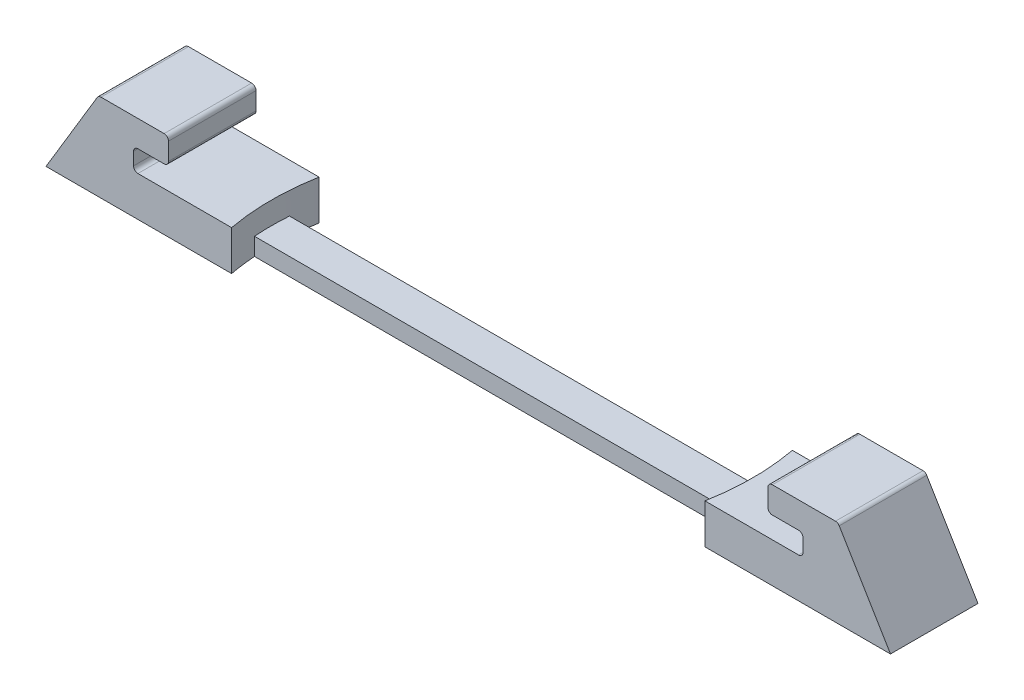
ISO-10303-21;
HEADER;
FILE_DESCRIPTION(('STEP AP214'),'2;1');
FILE_NAME('part.step','',(''),(''),'','','');
FILE_SCHEMA(('AUTOMOTIVE_DESIGN { 1 0 10303 214 1 1 1 1 }'));
ENDSEC;
DATA;
#1=APPLICATION_CONTEXT('core data for automotive mechanical design processes');
#2=APPLICATION_PROTOCOL_DEFINITION('international standard','automotive_design',2000,#1);
#3=PRODUCT_CONTEXT('',#1,'mechanical');
#4=PRODUCT('Part','Part','',(#3));
#5=PRODUCT_RELATED_PRODUCT_CATEGORY('part','',(#4));
#6=PRODUCT_DEFINITION_FORMATION('','',#4);
#7=PRODUCT_DEFINITION_CONTEXT('part definition',#1,'design');
#8=PRODUCT_DEFINITION('design','',#6,#7);
#9=PRODUCT_DEFINITION_SHAPE('','',#8);
#10=(LENGTH_UNIT() NAMED_UNIT(*) SI_UNIT(.MILLI.,.METRE.));
#11=(NAMED_UNIT(*) PLANE_ANGLE_UNIT() SI_UNIT($,.RADIAN.));
#12=(NAMED_UNIT(*) SI_UNIT($,.STERADIAN.) SOLID_ANGLE_UNIT());
#13=UNCERTAINTY_MEASURE_WITH_UNIT(LENGTH_MEASURE(1.E-05),#10,'distance_accuracy_value','');
#14=(GEOMETRIC_REPRESENTATION_CONTEXT(3) GLOBAL_UNCERTAINTY_ASSIGNED_CONTEXT((#13)) GLOBAL_UNIT_ASSIGNED_CONTEXT((#10,
#11,#12)) REPRESENTATION_CONTEXT('',''));
#15=CARTESIAN_POINT('',(0.,0.,0.));
#16=DIRECTION('',(0.,0.,1.));
#17=DIRECTION('',(1.,0.,0.));
#18=AXIS2_PLACEMENT_3D('',#15,#16,#17);
#19=CARTESIAN_POINT('',(0.,-2.55,0.));
#20=DIRECTION('',(0.,1.,0.));
#21=DIRECTION('',(0.,0.,1.));
#22=AXIS2_PLACEMENT_3D('',#19,#20,#21);
#23=PLANE('',#22);
#24=DIRECTION('',(-1.,0.,0.));
#25=VECTOR('',#24,1.);
#26=CARTESIAN_POINT('',(-65.6,-2.55,87.9999115054572));
#27=LINE('',#26,#25);
#28=CARTESIAN_POINT('',(-10.6728301493939,-2.55,87.9999115054572));
#29=VERTEX_POINT('',#28);
#30=CARTESIAN_POINT('',(-65.5271698506061,-2.55,87.9999115054572));
#31=VERTEX_POINT('',#30);
#32=EDGE_CURVE('E314',#29,#31,#27,.T.);
#33=ORIENTED_EDGE('',*,*,#32,.T.);
#34=CARTESIAN_POINT('',(-38.1,-2.55,90.));
#35=DIRECTION('',(0.,1.,0.));
#36=DIRECTION('',(0.,0.,1.));
#37=AXIS2_PLACEMENT_3D('',#34,#35,#36);
#38=CIRCLE('',#37,27.5);
#39=CARTESIAN_POINT('',(-65.5271827567168,-2.55,91.9999115054572));
#40=VERTEX_POINT('',#39);
#41=EDGE_CURVE('E306',#31,#40,#38,.T.);
#42=ORIENTED_EDGE('',*,*,#41,.T.);
#43=DIRECTION('',(1.,0.,0.));
#44=VECTOR('',#43,1.);
#45=CARTESIAN_POINT('',(-10.6,-2.55,91.9999115054572));
#46=LINE('',#45,#44);
#47=CARTESIAN_POINT('',(-10.6728172432833,-2.55,91.9999115054572));
#48=VERTEX_POINT('',#47);
#49=EDGE_CURVE('E317',#40,#48,#46,.T.);
#50=ORIENTED_EDGE('',*,*,#49,.T.);
#51=CARTESIAN_POINT('',(-38.1,-2.55,90.));
#52=DIRECTION('',(0.,1.,0.));
#53=DIRECTION('',(0.,0.,1.));
#54=AXIS2_PLACEMENT_3D('',#51,#52,#53);
#55=CIRCLE('',#54,27.5);
#56=EDGE_CURVE('E11',#29,#48,#55,.F.);
#57=ORIENTED_EDGE('',*,*,#56,.F.);
#58=EDGE_LOOP('',(#33,#42,#50,#57));
#59=FACE_BOUND('',#58,.T.);
#60=ADVANCED_FACE('F45',(#59),#23,.T.);
#61=CARTESIAN_POINT('',(-65.6,-2.55,87.9999115054572));
#62=DIRECTION('',(0.,0.,1.));
#63=DIRECTION('',(1.,0.,0.));
#64=AXIS2_PLACEMENT_3D('',#61,#62,#63);
#65=PLANE('',#64);
#66=DIRECTION('',(0.,1.,0.));
#67=VECTOR('',#66,1.);
#68=CARTESIAN_POINT('',(-65.5271698506061,-4.55000000000001,87.9999115054572));
#69=LINE('',#68,#67);
#70=CARTESIAN_POINT('',(-65.5271698506061,-4.55,87.9999115054572));
#71=VERTEX_POINT('',#70);
#72=EDGE_CURVE('E65',#31,#71,#69,.F.);
#73=ORIENTED_EDGE('',*,*,#72,.F.);
#74=ORIENTED_EDGE('',*,*,#32,.F.);
#75=DIRECTION('',(0.,1.,0.));
#76=VECTOR('',#75,1.);
#77=CARTESIAN_POINT('',(-10.6728301493939,-4.55000000000001,87.9999115054572));
#78=LINE('',#77,#76);
#79=CARTESIAN_POINT('',(-10.6728301493939,-4.55,87.9999115054572));
#80=VERTEX_POINT('',#79);
#81=EDGE_CURVE('E329',#29,#80,#78,.F.);
#82=ORIENTED_EDGE('',*,*,#81,.T.);
#83=DIRECTION('',(-1.,0.,0.));
#84=VECTOR('',#83,1.);
#85=CARTESIAN_POINT('',(-65.6,-4.55,87.9999115054572));
#86=LINE('',#85,#84);
#87=EDGE_CURVE('E61',#80,#71,#86,.T.);
#88=ORIENTED_EDGE('',*,*,#87,.T.);
#89=EDGE_LOOP('',(#73,#74,#82,#88));
#90=FACE_BOUND('',#89,.T.);
#91=ADVANCED_FACE('F680',(#90),#65,.F.);
#92=CARTESIAN_POINT('',(-10.6,-2.55,91.9999115054572));
#93=DIRECTION('',(0.,0.,-1.));
#94=DIRECTION('',(-1.,0.,0.));
#95=AXIS2_PLACEMENT_3D('',#92,#93,#94);
#96=PLANE('',#95);
#97=DIRECTION('',(0.,1.,0.));
#98=VECTOR('',#97,1.);
#99=CARTESIAN_POINT('',(-65.5271827567168,-4.55000000000001,91.9999115054572));
#100=LINE('',#99,#98);
#101=CARTESIAN_POINT('',(-65.5271827567168,-4.55,91.9999115054572));
#102=VERTEX_POINT('',#101);
#103=EDGE_CURVE('E297',#102,#40,#100,.T.);
#104=ORIENTED_EDGE('',*,*,#103,.F.);
#105=DIRECTION('',(1.,0.,0.));
#106=VECTOR('',#105,1.);
#107=CARTESIAN_POINT('',(-10.6,-4.55,91.9999115054572));
#108=LINE('',#107,#106);
#109=CARTESIAN_POINT('',(-10.6728172432833,-4.55,91.9999115054572));
#110=VERTEX_POINT('',#109);
#111=EDGE_CURVE('E318',#102,#110,#108,.T.);
#112=ORIENTED_EDGE('',*,*,#111,.T.);
#113=DIRECTION('',(0.,1.,0.));
#114=VECTOR('',#113,1.);
#115=CARTESIAN_POINT('',(-10.6728172432833,-4.55000000000001,91.9999115054572));
#116=LINE('',#115,#114);
#117=EDGE_CURVE('E321',#110,#48,#116,.T.);
#118=ORIENTED_EDGE('',*,*,#117,.T.);
#119=ORIENTED_EDGE('',*,*,#49,.F.);
#120=EDGE_LOOP('',(#104,#112,#118,#119));
#121=FACE_BOUND('',#120,.T.);
#122=ADVANCED_FACE('F687',(#121),#96,.F.);
#123=CARTESIAN_POINT('',(-38.1,-4.55000000000001,90.));
#124=DIRECTION('',(0.,1.,0.));
#125=DIRECTION('',(0.,0.,1.));
#126=AXIS2_PLACEMENT_3D('',#123,#124,#125);
#127=CYLINDRICAL_SURFACE('',#126,27.5);
#128=ORIENTED_EDGE('',*,*,#81,.F.);
#129=ORIENTED_EDGE('',*,*,#56,.T.);
#130=ORIENTED_EDGE('',*,*,#117,.F.);
#131=CARTESIAN_POINT('',(-38.1,-4.55000000000001,90.));
#132=DIRECTION('',(0.,1.,0.));
#133=DIRECTION('',(0.,0.,1.));
#134=AXIS2_PLACEMENT_3D('',#131,#132,#133);
#135=CIRCLE('',#134,27.5);
#136=CARTESIAN_POINT('',(-11.0583654340201,-4.55000000000001,95.));
#137=VERTEX_POINT('',#136);
#138=EDGE_CURVE('E418',#137,#110,#135,.T.);
#139=ORIENTED_EDGE('',*,*,#138,.F.);
#140=DIRECTION('',(0.,1.,0.));
#141=VECTOR('',#140,1.);
#142=CARTESIAN_POINT('',(-11.0583654340201,-4.55000000000001,95.));
#143=LINE('',#142,#141);
#144=CARTESIAN_POINT('',(-11.0583654340201,0.,95.));
#145=VERTEX_POINT('',#144);
#146=EDGE_CURVE('E54',#137,#145,#143,.T.);
#147=ORIENTED_EDGE('',*,*,#146,.T.);
#148=CARTESIAN_POINT('',(-38.1,0.,90.));
#149=DIRECTION('',(0.,1.,0.));
#150=DIRECTION('',(0.,0.,1.));
#151=AXIS2_PLACEMENT_3D('',#148,#149,#150);
#152=CIRCLE('',#151,27.5);
#153=CARTESIAN_POINT('',(-11.0583654340201,0.,85.));
#154=VERTEX_POINT('',#153);
#155=EDGE_CURVE('E417',#145,#154,#152,.T.);
#156=ORIENTED_EDGE('',*,*,#155,.T.);
#157=DIRECTION('',(0.,1.,0.));
#158=VECTOR('',#157,1.);
#159=CARTESIAN_POINT('',(-11.0583654340201,-4.55000000000001,85.));
#160=LINE('',#159,#158);
#161=CARTESIAN_POINT('',(-11.0583654340201,-4.55000000000001,85.));
#162=VERTEX_POINT('',#161);
#163=EDGE_CURVE('E470',#162,#154,#160,.T.);
#164=ORIENTED_EDGE('',*,*,#163,.F.);
#165=EDGE_CURVE('E423',#80,#162,#135,.T.);
#166=ORIENTED_EDGE('',*,*,#165,.F.);
#167=EDGE_LOOP('',(#128,#129,#130,#139,#147,#156,#164,#166));
#168=FACE_BOUND('',#167,.T.);
#169=ADVANCED_FACE('F478',(#168),#127,.F.);
#170=CARTESIAN_POINT('',(-0.350000000000003,0.499999999999991,180.));
#171=DIRECTION('',(0.,0.,-1.));
#172=DIRECTION('',(-1.,0.,0.));
#173=AXIS2_PLACEMENT_3D('',#170,#171,#172);
#174=CYLINDRICAL_SURFACE('',#173,0.5);
#175=DIRECTION('',(0.,0.,-1.));
#176=VECTOR('',#175,1.);
#177=CARTESIAN_POINT('',(-0.350000000000003,0.,180.));
#178=LINE('',#177,#176);
#179=CARTESIAN_POINT('',(-0.350000000000003,0.,95.));
#180=VERTEX_POINT('',#179);
#181=CARTESIAN_POINT('',(-0.350000000000003,0.,85.));
#182=VERTEX_POINT('',#181);
#183=EDGE_CURVE('E422',#180,#182,#178,.T.);
#184=ORIENTED_EDGE('',*,*,#183,.F.);
#185=CARTESIAN_POINT('',(-0.350000000000003,0.499999999999991,95.));
#186=DIRECTION('',(0.,0.,-1.));
#187=DIRECTION('',(-1.,0.,0.));
#188=AXIS2_PLACEMENT_3D('',#185,#186,#187);
#189=CIRCLE('',#188,0.5);
#190=CARTESIAN_POINT('',(0.149999999999997,0.499999999999991,95.));
#191=VERTEX_POINT('',#190);
#192=EDGE_CURVE('E387',#180,#191,#189,.F.);
#193=ORIENTED_EDGE('',*,*,#192,.T.);
#194=DIRECTION('',(0.,0.,-1.));
#195=VECTOR('',#194,1.);
#196=CARTESIAN_POINT('',(0.149999999999997,0.499999999999991,180.));
#197=LINE('',#196,#195);
#198=CARTESIAN_POINT('',(0.149999999999997,0.499999999999991,85.));
#199=VERTEX_POINT('',#198);
#200=EDGE_CURVE('E430',#191,#199,#197,.T.);
#201=ORIENTED_EDGE('',*,*,#200,.T.);
#202=CARTESIAN_POINT('',(-0.350000000000003,0.499999999999991,85.));
#203=DIRECTION('',(0.,0.,-1.));
#204=DIRECTION('',(-1.,0.,0.));
#205=AXIS2_PLACEMENT_3D('',#202,#203,#204);
#206=CIRCLE('',#205,0.5);
#207=EDGE_CURVE('E351',#182,#199,#206,.F.);
#208=ORIENTED_EDGE('',*,*,#207,.F.);
#209=EDGE_LOOP('',(#184,#193,#201,#208));
#210=FACE_BOUND('',#209,.T.);
#211=ADVANCED_FACE('F491',(#210),#174,.F.);
#212=CARTESIAN_POINT('',(0.149999999999997,0.,180.));
#213=DIRECTION('',(1.,0.,0.));
#214=DIRECTION('',(0.,0.,-1.));
#215=AXIS2_PLACEMENT_3D('',#212,#213,#214);
#216=PLANE('',#215);
#217=ORIENTED_EDGE('',*,*,#200,.F.);
#218=DIRECTION('',(0.,1.,0.));
#219=VECTOR('',#218,1.);
#220=CARTESIAN_POINT('',(0.149999999999997,0.,95.));
#221=LINE('',#220,#219);
#222=CARTESIAN_POINT('',(0.149999999999997,1.94999999999999,95.));
#223=VERTEX_POINT('',#222);
#224=EDGE_CURVE('E391',#191,#223,#221,.T.);
#225=ORIENTED_EDGE('',*,*,#224,.T.);
#226=DIRECTION('',(0.,0.,-1.));
#227=VECTOR('',#226,1.);
#228=CARTESIAN_POINT('',(0.149999999999997,1.94999999999999,180.));
#229=LINE('',#228,#227);
#230=CARTESIAN_POINT('',(0.149999999999997,1.94999999999999,85.));
#231=VERTEX_POINT('',#230);
#232=EDGE_CURVE('E434',#223,#231,#229,.T.);
#233=ORIENTED_EDGE('',*,*,#232,.T.);
#234=DIRECTION('',(0.,1.,0.));
#235=VECTOR('',#234,1.);
#236=CARTESIAN_POINT('',(0.149999999999997,0.,85.));
#237=LINE('',#236,#235);
#238=EDGE_CURVE('E354',#199,#231,#237,.T.);
#239=ORIENTED_EDGE('',*,*,#238,.F.);
#240=EDGE_LOOP('',(#217,#225,#233,#239));
#241=FACE_BOUND('',#240,.T.);
#242=ADVANCED_FACE('F494',(#241),#216,.F.);
#243=CARTESIAN_POINT('',(-0.350000000000003,1.94999999999999,180.));
#244=DIRECTION('',(0.,0.,-1.));
#245=DIRECTION('',(-1.,0.,0.));
#246=AXIS2_PLACEMENT_3D('',#243,#244,#245);
#247=CYLINDRICAL_SURFACE('',#246,0.5);
#248=CARTESIAN_POINT('',(-0.350000000000003,1.94999999999999,95.));
#249=DIRECTION('',(0.,0.,-1.));
#250=DIRECTION('',(-1.,0.,0.));
#251=AXIS2_PLACEMENT_3D('',#248,#249,#250);
#252=CIRCLE('',#251,0.5);
#253=CARTESIAN_POINT('',(-0.350000000000003,2.44999999999999,95.));
#254=VERTEX_POINT('',#253);
#255=EDGE_CURVE('E395',#254,#223,#252,.T.);
#256=ORIENTED_EDGE('',*,*,#255,.F.);
#257=DIRECTION('',(0.,0.,-1.));
#258=VECTOR('',#257,1.);
#259=CARTESIAN_POINT('',(-0.350000000000003,2.44999999999999,180.));
#260=LINE('',#259,#258);
#261=CARTESIAN_POINT('',(-0.350000000000003,2.44999999999999,85.));
#262=VERTEX_POINT('',#261);
#263=EDGE_CURVE('E438',#254,#262,#260,.T.);
#264=ORIENTED_EDGE('',*,*,#263,.T.);
#265=CARTESIAN_POINT('',(-0.350000000000003,1.94999999999999,85.));
#266=DIRECTION('',(0.,0.,-1.));
#267=DIRECTION('',(-1.,0.,0.));
#268=AXIS2_PLACEMENT_3D('',#265,#266,#267);
#269=CIRCLE('',#268,0.5);
#270=EDGE_CURVE('E357',#262,#231,#269,.T.);
#271=ORIENTED_EDGE('',*,*,#270,.T.);
#272=ORIENTED_EDGE('',*,*,#232,.F.);
#273=EDGE_LOOP('',(#256,#264,#271,#272));
#274=FACE_BOUND('',#273,.T.);
#275=ADVANCED_FACE('F498',(#274),#247,.F.);
#276=CARTESIAN_POINT('',(0.,2.44999999999999,180.));
#277=DIRECTION('',(0.,-1.,0.));
#278=DIRECTION('',(0.,0.,-1.));
#279=AXIS2_PLACEMENT_3D('',#276,#277,#278);
#280=PLANE('',#279);
#281=DIRECTION('',(1.,0.,0.));
#282=VECTOR('',#281,1.);
#283=CARTESIAN_POINT('',(0.,2.44999999999999,95.));
#284=LINE('',#283,#282);
#285=CARTESIAN_POINT('',(-3.34999999999999,2.44999999999999,95.));
#286=VERTEX_POINT('',#285);
#287=EDGE_CURVE('E398',#286,#254,#284,.T.);
#288=ORIENTED_EDGE('',*,*,#287,.F.);
#289=DIRECTION('',(0.,0.,-1.));
#290=VECTOR('',#289,1.);
#291=CARTESIAN_POINT('',(-3.34999999999999,2.44999999999999,180.));
#292=LINE('',#291,#290);
#293=CARTESIAN_POINT('',(-3.34999999999999,2.44999999999999,85.));
#294=VERTEX_POINT('',#293);
#295=EDGE_CURVE('E442',#286,#294,#292,.T.);
#296=ORIENTED_EDGE('',*,*,#295,.T.);
#297=DIRECTION('',(1.,0.,0.));
#298=VECTOR('',#297,1.);
#299=CARTESIAN_POINT('',(0.,2.44999999999999,85.));
#300=LINE('',#299,#298);
#301=EDGE_CURVE('E361',#294,#262,#300,.T.);
#302=ORIENTED_EDGE('',*,*,#301,.T.);
#303=ORIENTED_EDGE('',*,*,#263,.F.);
#304=EDGE_LOOP('',(#288,#296,#302,#303));
#305=FACE_BOUND('',#304,.T.);
#306=ADVANCED_FACE('F502',(#305),#280,.T.);
#307=CARTESIAN_POINT('',(-3.34999999999999,2.94999999999999,180.));
#308=DIRECTION('',(0.,0.,-1.));
#309=DIRECTION('',(-1.,0.,0.));
#310=AXIS2_PLACEMENT_3D('',#307,#308,#309);
#311=CYLINDRICAL_SURFACE('',#310,0.500000000000007);
#312=CARTESIAN_POINT('',(-3.34999999999999,2.94999999999999,95.));
#313=DIRECTION('',(0.,0.,-1.));
#314=DIRECTION('',(-1.,0.,0.));
#315=AXIS2_PLACEMENT_3D('',#312,#313,#314);
#316=CIRCLE('',#315,0.500000000000007);
#317=CARTESIAN_POINT('',(-3.85,2.94999999999999,95.));
#318=VERTEX_POINT('',#317);
#319=EDGE_CURVE('E401',#318,#286,#316,.F.);
#320=ORIENTED_EDGE('',*,*,#319,.F.);
#321=DIRECTION('',(0.,0.,-1.));
#322=VECTOR('',#321,1.);
#323=CARTESIAN_POINT('',(-3.85000000000001,2.94999999999999,180.));
#324=LINE('',#323,#322);
#325=CARTESIAN_POINT('',(-3.85,2.94999999999999,85.));
#326=VERTEX_POINT('',#325);
#327=EDGE_CURVE('E446',#318,#326,#324,.T.);
#328=ORIENTED_EDGE('',*,*,#327,.T.);
#329=CARTESIAN_POINT('',(-3.34999999999999,2.94999999999999,85.));
#330=DIRECTION('',(0.,0.,-1.));
#331=DIRECTION('',(-1.,0.,0.));
#332=AXIS2_PLACEMENT_3D('',#329,#330,#331);
#333=CIRCLE('',#332,0.500000000000007);
#334=EDGE_CURVE('E365',#326,#294,#333,.F.);
#335=ORIENTED_EDGE('',*,*,#334,.T.);
#336=ORIENTED_EDGE('',*,*,#295,.F.);
#337=EDGE_LOOP('',(#320,#328,#335,#336));
#338=FACE_BOUND('',#337,.T.);
#339=ADVANCED_FACE('F506',(#338),#311,.T.);
#340=CARTESIAN_POINT('',(-3.85000000000001,0.,180.));
#341=DIRECTION('',(-1.,0.,0.));
#342=DIRECTION('',(0.,0.,1.));
#343=AXIS2_PLACEMENT_3D('',#340,#341,#342);
#344=PLANE('',#343);
#345=DIRECTION('',(0.,-1.,0.));
#346=VECTOR('',#345,1.);
#347=CARTESIAN_POINT('',(-3.85000000000001,0.,95.));
#348=LINE('',#347,#346);
#349=CARTESIAN_POINT('',(-3.85000000000001,4.94999999999999,95.));
#350=VERTEX_POINT('',#349);
#351=EDGE_CURVE('E404',#350,#318,#348,.T.);
#352=ORIENTED_EDGE('',*,*,#351,.F.);
#353=DIRECTION('',(0.,0.,-1.));
#354=VECTOR('',#353,1.);
#355=CARTESIAN_POINT('',(-3.85000000000001,4.94999999999999,180.));
#356=LINE('',#355,#354);
#357=CARTESIAN_POINT('',(-3.85000000000001,4.94999999999999,85.));
#358=VERTEX_POINT('',#357);
#359=EDGE_CURVE('E450',#350,#358,#356,.T.);
#360=ORIENTED_EDGE('',*,*,#359,.T.);
#361=DIRECTION('',(0.,-1.,0.));
#362=VECTOR('',#361,1.);
#363=CARTESIAN_POINT('',(-3.85000000000001,0.,85.));
#364=LINE('',#363,#362);
#365=EDGE_CURVE('E369',#358,#326,#364,.T.);
#366=ORIENTED_EDGE('',*,*,#365,.T.);
#367=ORIENTED_EDGE('',*,*,#327,.F.);
#368=EDGE_LOOP('',(#352,#360,#366,#367));
#369=FACE_BOUND('',#368,.T.);
#370=ADVANCED_FACE('F510',(#369),#344,.T.);
#371=CARTESIAN_POINT('',(-3.34999999999999,4.94999999999999,180.));
#372=DIRECTION('',(0.,0.,-1.));
#373=DIRECTION('',(-1.,0.,0.));
#374=AXIS2_PLACEMENT_3D('',#371,#372,#373);
#375=CYLINDRICAL_SURFACE('',#374,0.500000000000007);
#376=CARTESIAN_POINT('',(-3.34999999999999,4.94999999999999,95.));
#377=DIRECTION('',(0.,0.,-1.));
#378=DIRECTION('',(-1.,0.,0.));
#379=AXIS2_PLACEMENT_3D('',#376,#377,#378);
#380=CIRCLE('',#379,0.500000000000007);
#381=CARTESIAN_POINT('',(-3.34999999999999,5.45,95.));
#382=VERTEX_POINT('',#381);
#383=EDGE_CURVE('E407',#382,#350,#380,.F.);
#384=ORIENTED_EDGE('',*,*,#383,.F.);
#385=DIRECTION('',(0.,0.,-1.));
#386=VECTOR('',#385,1.);
#387=CARTESIAN_POINT('',(-3.34999999999999,5.44999999999999,180.));
#388=LINE('',#387,#386);
#389=CARTESIAN_POINT('',(-3.34999999999999,5.45,85.));
#390=VERTEX_POINT('',#389);
#391=EDGE_CURVE('E454',#382,#390,#388,.T.);
#392=ORIENTED_EDGE('',*,*,#391,.T.);
#393=CARTESIAN_POINT('',(-3.34999999999999,4.94999999999999,85.));
#394=DIRECTION('',(0.,0.,-1.));
#395=DIRECTION('',(-1.,0.,0.));
#396=AXIS2_PLACEMENT_3D('',#393,#394,#395);
#397=CIRCLE('',#396,0.500000000000007);
#398=EDGE_CURVE('E373',#390,#358,#397,.F.);
#399=ORIENTED_EDGE('',*,*,#398,.T.);
#400=ORIENTED_EDGE('',*,*,#359,.F.);
#401=EDGE_LOOP('',(#384,#392,#399,#400));
#402=FACE_BOUND('',#401,.T.);
#403=ADVANCED_FACE('F514',(#402),#375,.T.);
#404=CARTESIAN_POINT('',(0.,5.45,180.));
#405=DIRECTION('',(0.,1.,0.));
#406=DIRECTION('',(-1.,0.,0.));
#407=AXIS2_PLACEMENT_3D('',#404,#405,#406);
#408=PLANE('',#407);
#409=DIRECTION('',(-1.,0.,0.));
#410=VECTOR('',#409,1.);
#411=CARTESIAN_POINT('',(0.,5.45,95.));
#412=LINE('',#411,#410);
#413=CARTESIAN_POINT('',(3.86690481051548,5.45,95.));
#414=VERTEX_POINT('',#413);
#415=EDGE_CURVE('E338',#414,#382,#412,.T.);
#416=ORIENTED_EDGE('',*,*,#415,.F.);
#417=DIRECTION('',(0.,0.,-1.));
#418=VECTOR('',#417,1.);
#419=CARTESIAN_POINT('',(3.86690481051548,5.44999999999999,180.));
#420=LINE('',#419,#418);
#421=CARTESIAN_POINT('',(3.86690481051548,5.45,85.));
#422=VERTEX_POINT('',#421);
#423=EDGE_CURVE('E458',#414,#422,#420,.T.);
#424=ORIENTED_EDGE('',*,*,#423,.T.);
#425=DIRECTION('',(-1.,0.,0.));
#426=VECTOR('',#425,1.);
#427=CARTESIAN_POINT('',(0.,5.45,85.));
#428=LINE('',#427,#426);
#429=EDGE_CURVE('E332',#422,#390,#428,.T.);
#430=ORIENTED_EDGE('',*,*,#429,.T.);
#431=ORIENTED_EDGE('',*,*,#391,.F.);
#432=EDGE_LOOP('',(#416,#424,#430,#431));
#433=FACE_BOUND('',#432,.T.);
#434=ADVANCED_FACE('F518',(#433),#408,.T.);
#435=CARTESIAN_POINT('',(5.45588235294117,3.27352941176471,180.));
#436=DIRECTION('',(-0.857492925712544,-0.514495755427527,0.));
#437=DIRECTION('',(0.514495755427527,-0.857492925712544,0.));
#438=AXIS2_PLACEMENT_3D('',#435,#436,#437);
#439=PLANE('',#438);
#440=DIRECTION('',(0.,0.,-1.));
#441=VECTOR('',#440,1.);
#442=CARTESIAN_POINT('',(4.29565127337174,5.20724787771375,180.));
#443=LINE('',#442,#441);
#444=CARTESIAN_POINT('',(4.29565127337174,5.20724787771375,95.));
#445=VERTEX_POINT('',#444);
#446=CARTESIAN_POINT('',(4.29565127337174,5.20724787771375,85.));
#447=VERTEX_POINT('',#446);
#448=EDGE_CURVE('E462',#445,#447,#443,.T.);
#449=ORIENTED_EDGE('',*,*,#448,.F.);
#450=DIRECTION('',(0.514495755427527,-0.857492925712544,0.));
#451=VECTOR('',#450,1.);
#452=CARTESIAN_POINT('',(5.45588235294117,3.27352941176471,95.));
#453=LINE('',#452,#451);
#454=CARTESIAN_POINT('',(10.15,-4.55000000000001,95.));
#455=VERTEX_POINT('',#454);
#456=EDGE_CURVE('E410',#445,#455,#453,.T.);
#457=ORIENTED_EDGE('',*,*,#456,.T.);
#458=DIRECTION('',(0.,0.,-1.));
#459=VECTOR('',#458,1.);
#460=CARTESIAN_POINT('',(10.15,-4.55000000000001,180.));
#461=LINE('',#460,#459);
#462=CARTESIAN_POINT('',(10.15,-4.55000000000001,85.));
#463=VERTEX_POINT('',#462);
#464=EDGE_CURVE('E466',#455,#463,#461,.T.);
#465=ORIENTED_EDGE('',*,*,#464,.T.);
#466=DIRECTION('',(0.514495755427527,-0.857492925712544,0.));
#467=VECTOR('',#466,1.);
#468=CARTESIAN_POINT('',(5.45588235294117,3.27352941176471,85.));
#469=LINE('',#468,#467);
#470=EDGE_CURVE('E377',#447,#463,#469,.T.);
#471=ORIENTED_EDGE('',*,*,#470,.F.);
#472=EDGE_LOOP('',(#449,#457,#465,#471));
#473=FACE_BOUND('',#472,.T.);
#474=ADVANCED_FACE('F526',(#473),#439,.F.);
#475=CARTESIAN_POINT('',(3.86690481051548,4.94999999999999,180.));
#476=DIRECTION('',(0.,0.,-1.));
#477=DIRECTION('',(-1.,0.,0.));
#478=AXIS2_PLACEMENT_3D('',#475,#476,#477);
#479=CYLINDRICAL_SURFACE('',#478,0.499999999999993);
#480=CARTESIAN_POINT('',(3.86690481051548,4.94999999999999,95.));
#481=DIRECTION('',(0.,0.,-1.));
#482=DIRECTION('',(-1.,0.,0.));
#483=AXIS2_PLACEMENT_3D('',#480,#481,#482);
#484=CIRCLE('',#483,0.499999999999993);
#485=EDGE_CURVE('E414',#445,#414,#484,.F.);
#486=ORIENTED_EDGE('',*,*,#485,.F.);
#487=ORIENTED_EDGE('',*,*,#448,.T.);
#488=CARTESIAN_POINT('',(3.86690481051548,4.94999999999999,85.));
#489=DIRECTION('',(0.,0.,-1.));
#490=DIRECTION('',(-1.,0.,0.));
#491=AXIS2_PLACEMENT_3D('',#488,#489,#490);
#492=CIRCLE('',#491,0.499999999999993);
#493=EDGE_CURVE('E380',#447,#422,#492,.F.);
#494=ORIENTED_EDGE('',*,*,#493,.T.);
#495=ORIENTED_EDGE('',*,*,#423,.F.);
#496=EDGE_LOOP('',(#486,#487,#494,#495));
#497=FACE_BOUND('',#496,.T.);
#498=ADVANCED_FACE('F523',(#497),#479,.T.);
#499=CARTESIAN_POINT('',(0.,0.,180.));
#500=DIRECTION('',(0.,1.,0.));
#501=DIRECTION('',(0.,0.,1.));
#502=AXIS2_PLACEMENT_3D('',#499,#500,#501);
#503=PLANE('',#502);
#504=DIRECTION('',(-1.,0.,0.));
#505=VECTOR('',#504,1.);
#506=CARTESIAN_POINT('',(0.,0.,95.));
#507=LINE('',#506,#505);
#508=EDGE_CURVE('E384',#180,#145,#507,.T.);
#509=ORIENTED_EDGE('',*,*,#508,.F.);
#510=ORIENTED_EDGE('',*,*,#183,.T.);
#511=DIRECTION('',(-1.,0.,0.));
#512=VECTOR('',#511,1.);
#513=CARTESIAN_POINT('',(0.,0.,85.));
#514=LINE('',#513,#512);
#515=EDGE_CURVE('E337',#182,#154,#514,.T.);
#516=ORIENTED_EDGE('',*,*,#515,.T.);
#517=ORIENTED_EDGE('',*,*,#155,.F.);
#518=EDGE_LOOP('',(#509,#510,#516,#517));
#519=FACE_BOUND('',#518,.T.);
#520=ADVANCED_FACE('F484',(#519),#503,.T.);
#521=CARTESIAN_POINT('',(0.,-4.54999999999998,180.));
#522=DIRECTION('',(0.,-1.,0.));
#523=DIRECTION('',(1.,0.,0.));
#524=AXIS2_PLACEMENT_3D('',#521,#522,#523);
#525=PLANE('',#524);
#526=CARTESIAN_POINT('',(-38.1,-4.55000000000001,90.));
#527=DIRECTION('',(0.,1.,0.));
#528=DIRECTION('',(0.,0.,1.));
#529=AXIS2_PLACEMENT_3D('',#526,#527,#528);
#530=CIRCLE('',#529,27.5);
#531=CARTESIAN_POINT('',(-65.1416345659799,-4.55000000000001,85.));
#532=VERTEX_POINT('',#531);
#533=EDGE_CURVE('E254',#532,#71,#530,.T.);
#534=ORIENTED_EDGE('',*,*,#533,.T.);
#535=ORIENTED_EDGE('',*,*,#87,.F.);
#536=ORIENTED_EDGE('',*,*,#165,.T.);
#537=DIRECTION('',(-1.,0.,0.));
#538=VECTOR('',#537,1.);
#539=CARTESIAN_POINT('',(0.,-4.55000000000001,85.));
#540=LINE('',#539,#538);
#541=EDGE_CURVE('E341',#463,#162,#540,.T.);
#542=ORIENTED_EDGE('',*,*,#541,.F.);
#543=ORIENTED_EDGE('',*,*,#464,.F.);
#544=DIRECTION('',(-1.,0.,0.));
#545=VECTOR('',#544,1.);
#546=CARTESIAN_POINT('',(0.,-4.55000000000001,95.));
#547=LINE('',#546,#545);
#548=EDGE_CURVE('E333',#455,#137,#547,.T.);
#549=ORIENTED_EDGE('',*,*,#548,.T.);
#550=ORIENTED_EDGE('',*,*,#138,.T.);
#551=ORIENTED_EDGE('',*,*,#111,.F.);
#552=CARTESIAN_POINT('',(-65.1416345659799,-4.55000000000001,95.));
#553=VERTEX_POINT('',#552);
#554=EDGE_CURVE('E665',#102,#553,#530,.T.);
#555=ORIENTED_EDGE('',*,*,#554,.T.);
#556=DIRECTION('',(-1.,0.,0.));
#557=VECTOR('',#556,1.);
#558=CARTESIAN_POINT('',(0.,-4.55000000000001,95.));
#559=LINE('',#558,#557);
#560=CARTESIAN_POINT('',(-86.35,-4.55000000000001,95.));
#561=VERTEX_POINT('',#560);
#562=EDGE_CURVE('E289',#553,#561,#559,.T.);
#563=ORIENTED_EDGE('',*,*,#562,.T.);
#564=DIRECTION('',(0.,0.,-1.));
#565=VECTOR('',#564,1.);
#566=CARTESIAN_POINT('',(-86.35,-4.55,180.));
#567=LINE('',#566,#565);
#568=CARTESIAN_POINT('',(-86.35,-4.55000000000001,85.));
#569=VERTEX_POINT('',#568);
#570=EDGE_CURVE('E293',#561,#569,#567,.T.);
#571=ORIENTED_EDGE('',*,*,#570,.T.);
#572=DIRECTION('',(-1.,0.,0.));
#573=VECTOR('',#572,1.);
#574=CARTESIAN_POINT('',(0.,-4.55000000000001,85.));
#575=LINE('',#574,#573);
#576=EDGE_CURVE('E265',#532,#569,#575,.T.);
#577=ORIENTED_EDGE('',*,*,#576,.F.);
#578=EDGE_LOOP('',(#534,#535,#536,#542,#543,#549,#550,#551,#555,#563,#571,#577));
#579=FACE_BOUND('',#578,.T.);
#580=ADVANCED_FACE('F47',(#579),#525,.T.);
#581=CARTESIAN_POINT('',(0.,-4.55000000000001,85.));
#582=DIRECTION('',(0.,0.,-1.));
#583=DIRECTION('',(-1.,0.,0.));
#584=AXIS2_PLACEMENT_3D('',#581,#582,#583);
#585=PLANE('',#584);
#586=ORIENTED_EDGE('',*,*,#470,.T.);
#587=ORIENTED_EDGE('',*,*,#541,.T.);
#588=ORIENTED_EDGE('',*,*,#163,.T.);
#589=ORIENTED_EDGE('',*,*,#515,.F.);
#590=ORIENTED_EDGE('',*,*,#207,.T.);
#591=ORIENTED_EDGE('',*,*,#238,.T.);
#592=ORIENTED_EDGE('',*,*,#270,.F.);
#593=ORIENTED_EDGE('',*,*,#301,.F.);
#594=ORIENTED_EDGE('',*,*,#334,.F.);
#595=ORIENTED_EDGE('',*,*,#365,.F.);
#596=ORIENTED_EDGE('',*,*,#398,.F.);
#597=ORIENTED_EDGE('',*,*,#429,.F.);
#598=ORIENTED_EDGE('',*,*,#493,.F.);
#599=EDGE_LOOP('',(#586,#587,#588,#589,#590,#591,#592,#593,#594,#595,#596,#597,#598));
#600=FACE_BOUND('',#599,.T.);
#601=ADVANCED_FACE('F488',(#600),#585,.T.);
#602=CARTESIAN_POINT('',(0.,-4.55000000000001,95.));
#603=DIRECTION('',(0.,0.,-1.));
#604=DIRECTION('',(-1.,0.,0.));
#605=AXIS2_PLACEMENT_3D('',#602,#603,#604);
#606=PLANE('',#605);
#607=ORIENTED_EDGE('',*,*,#485,.T.);
#608=ORIENTED_EDGE('',*,*,#415,.T.);
#609=ORIENTED_EDGE('',*,*,#383,.T.);
#610=ORIENTED_EDGE('',*,*,#351,.T.);
#611=ORIENTED_EDGE('',*,*,#319,.T.);
#612=ORIENTED_EDGE('',*,*,#287,.T.);
#613=ORIENTED_EDGE('',*,*,#255,.T.);
#614=ORIENTED_EDGE('',*,*,#224,.F.);
#615=ORIENTED_EDGE('',*,*,#192,.F.);
#616=ORIENTED_EDGE('',*,*,#508,.T.);
#617=ORIENTED_EDGE('',*,*,#146,.F.);
#618=ORIENTED_EDGE('',*,*,#548,.F.);
#619=ORIENTED_EDGE('',*,*,#456,.F.);
#620=EDGE_LOOP('',(#607,#608,#609,#610,#611,#612,#613,#614,#615,#616,#617,#618,#619));
#621=FACE_BOUND('',#620,.T.);
#622=ADVANCED_FACE('F695',(#621),#606,.F.);
#623=CARTESIAN_POINT('',(-38.1,-4.55000000000001,90.));
#624=DIRECTION('',(0.,1.,0.));
#625=DIRECTION('',(0.,0.,1.));
#626=AXIS2_PLACEMENT_3D('',#623,#624,#625);
#627=CYLINDRICAL_SURFACE('',#626,27.5);
#628=ORIENTED_EDGE('',*,*,#41,.F.);
#629=ORIENTED_EDGE('',*,*,#72,.T.);
#630=ORIENTED_EDGE('',*,*,#533,.F.);
#631=DIRECTION('',(0.,1.,0.));
#632=VECTOR('',#631,1.);
#633=CARTESIAN_POINT('',(-65.1416345659799,-4.55000000000001,85.));
#634=LINE('',#633,#632);
#635=CARTESIAN_POINT('',(-65.1416345659799,0.,85.));
#636=VERTEX_POINT('',#635);
#637=EDGE_CURVE('E244',#636,#532,#634,.F.);
#638=ORIENTED_EDGE('',*,*,#637,.F.);
#639=CARTESIAN_POINT('',(-38.1,0.,90.));
#640=DIRECTION('',(0.,1.,0.));
#641=DIRECTION('',(0.,0.,1.));
#642=AXIS2_PLACEMENT_3D('',#639,#640,#641);
#643=CIRCLE('',#642,27.5);
#644=CARTESIAN_POINT('',(-65.1416345659799,0.,95.));
#645=VERTEX_POINT('',#644);
#646=EDGE_CURVE('E262',#636,#645,#643,.T.);
#647=ORIENTED_EDGE('',*,*,#646,.T.);
#648=DIRECTION('',(0.,1.,0.));
#649=VECTOR('',#648,1.);
#650=CARTESIAN_POINT('',(-65.1416345659799,-4.55000000000001,95.));
#651=LINE('',#650,#649);
#652=EDGE_CURVE('E272',#645,#553,#651,.F.);
#653=ORIENTED_EDGE('',*,*,#652,.T.);
#654=ORIENTED_EDGE('',*,*,#554,.F.);
#655=ORIENTED_EDGE('',*,*,#103,.T.);
#656=EDGE_LOOP('',(#628,#629,#630,#638,#647,#653,#654,#655));
#657=FACE_BOUND('',#656,.T.);
#658=ADVANCED_FACE('F260',(#657),#627,.F.);
#659=CARTESIAN_POINT('',(0.,0.,180.));
#660=DIRECTION('',(0.,1.,0.));
#661=DIRECTION('',(0.,0.,1.));
#662=AXIS2_PLACEMENT_3D('',#659,#660,#661);
#663=PLANE('',#662);
#664=DIRECTION('',(-1.,0.,0.));
#665=VECTOR('',#664,1.);
#666=CARTESIAN_POINT('',(0.,0.,95.));
#667=LINE('',#666,#665);
#668=CARTESIAN_POINT('',(-75.85,0.,95.));
#669=VERTEX_POINT('',#668);
#670=EDGE_CURVE('E270',#645,#669,#667,.T.);
#671=ORIENTED_EDGE('',*,*,#670,.F.);
#672=ORIENTED_EDGE('',*,*,#646,.F.);
#673=DIRECTION('',(-1.,0.,0.));
#674=VECTOR('',#673,1.);
#675=CARTESIAN_POINT('',(0.,0.,85.));
#676=LINE('',#675,#674);
#677=CARTESIAN_POINT('',(-75.85,0.,85.));
#678=VERTEX_POINT('',#677);
#679=EDGE_CURVE('E241',#636,#678,#676,.T.);
#680=ORIENTED_EDGE('',*,*,#679,.T.);
#681=DIRECTION('',(0.,0.,-1.));
#682=VECTOR('',#681,1.);
#683=CARTESIAN_POINT('',(-75.85,0.,180.));
#684=LINE('',#683,#682);
#685=EDGE_CURVE('E562',#669,#678,#684,.T.);
#686=ORIENTED_EDGE('',*,*,#685,.F.);
#687=EDGE_LOOP('',(#671,#672,#680,#686));
#688=FACE_BOUND('',#687,.T.);
#689=ADVANCED_FACE('F269',(#688),#663,.T.);
#690=CARTESIAN_POINT('',(0.,5.45000000000032,180.));
#691=DIRECTION('',(0.,-1.,0.));
#692=DIRECTION('',(1.,0.,0.));
#693=AXIS2_PLACEMENT_3D('',#690,#691,#692);
#694=PLANE('',#693);
#695=DIRECTION('',(0.,0.,-1.));
#696=VECTOR('',#695,1.);
#697=CARTESIAN_POINT('',(-80.0669048105155,5.45,180.));
#698=LINE('',#697,#696);
#699=CARTESIAN_POINT('',(-80.0669048105155,5.45,95.));
#700=VERTEX_POINT('',#699);
#701=CARTESIAN_POINT('',(-80.0669048105155,5.45,85.));
#702=VERTEX_POINT('',#701);
#703=EDGE_CURVE('E569',#700,#702,#698,.T.);
#704=ORIENTED_EDGE('',*,*,#703,.F.);
#705=DIRECTION('',(-1.,0.,0.));
#706=VECTOR('',#705,1.);
#707=CARTESIAN_POINT('',(0.,5.45,95.));
#708=LINE('',#707,#706);
#709=CARTESIAN_POINT('',(-72.85,5.45,95.));
#710=VERTEX_POINT('',#709);
#711=EDGE_CURVE('E294',#710,#700,#708,.T.);
#712=ORIENTED_EDGE('',*,*,#711,.F.);
#713=DIRECTION('',(0.,0.,-1.));
#714=VECTOR('',#713,1.);
#715=CARTESIAN_POINT('',(-72.85,5.45,180.));
#716=LINE('',#715,#714);
#717=CARTESIAN_POINT('',(-72.85,5.45,85.));
#718=VERTEX_POINT('',#717);
#719=EDGE_CURVE('E253',#710,#718,#716,.T.);
#720=ORIENTED_EDGE('',*,*,#719,.T.);
#721=DIRECTION('',(-1.,0.,0.));
#722=VECTOR('',#721,1.);
#723=CARTESIAN_POINT('',(0.,5.45,85.));
#724=LINE('',#723,#722);
#725=EDGE_CURVE('E301',#718,#702,#724,.T.);
#726=ORIENTED_EDGE('',*,*,#725,.T.);
#727=EDGE_LOOP('',(#704,#712,#720,#726));
#728=FACE_BOUND('',#727,.T.);
#729=ADVANCED_FACE('F651',(#728),#694,.F.);
#730=CARTESIAN_POINT('',(-80.0669048105155,4.95,180.));
#731=DIRECTION('',(0.,0.,-1.));
#732=DIRECTION('',(-1.,0.,0.));
#733=AXIS2_PLACEMENT_3D('',#730,#731,#732);
#734=CYLINDRICAL_SURFACE('',#733,0.499999999999994);
#735=DIRECTION('',(0.,0.,-1.));
#736=VECTOR('',#735,1.);
#737=CARTESIAN_POINT('',(-80.4956512733717,5.20724787771375,180.));
#738=LINE('',#737,#736);
#739=CARTESIAN_POINT('',(-80.4956512733717,5.20724787771376,95.));
#740=VERTEX_POINT('',#739);
#741=CARTESIAN_POINT('',(-80.4956512733717,5.20724787771376,85.));
#742=VERTEX_POINT('',#741);
#743=EDGE_CURVE('E280',#740,#742,#738,.T.);
#744=ORIENTED_EDGE('',*,*,#743,.F.);
#745=CARTESIAN_POINT('',(-80.0669048105155,4.95,95.));
#746=DIRECTION('',(0.,0.,-1.));
#747=DIRECTION('',(-1.,0.,0.));
#748=AXIS2_PLACEMENT_3D('',#745,#746,#747);
#749=CIRCLE('',#748,0.499999999999994);
#750=EDGE_CURVE('E305',#740,#700,#749,.T.);
#751=ORIENTED_EDGE('',*,*,#750,.T.);
#752=ORIENTED_EDGE('',*,*,#703,.T.);
#753=CARTESIAN_POINT('',(-80.0669048105155,4.95,85.));
#754=DIRECTION('',(0.,0.,-1.));
#755=DIRECTION('',(-1.,0.,0.));
#756=AXIS2_PLACEMENT_3D('',#753,#754,#755);
#757=CIRCLE('',#756,0.499999999999994);
#758=EDGE_CURVE('E277',#742,#702,#757,.T.);
#759=ORIENTED_EDGE('',*,*,#758,.F.);
#760=EDGE_LOOP('',(#744,#751,#752,#759));
#761=FACE_BOUND('',#760,.T.);
#762=ADVANCED_FACE('F655',(#761),#734,.T.);
#763=CARTESIAN_POINT('',(-75.85,0.499999999999991,180.));
#764=DIRECTION('',(0.,0.,-1.));
#765=DIRECTION('',(-1.,0.,0.));
#766=AXIS2_PLACEMENT_3D('',#763,#764,#765);
#767=CYLINDRICAL_SURFACE('',#766,0.5);
#768=CARTESIAN_POINT('',(-75.85,0.499999999999991,95.));
#769=DIRECTION('',(0.,0.,-1.));
#770=DIRECTION('',(-1.,0.,0.));
#771=AXIS2_PLACEMENT_3D('',#768,#769,#770);
#772=CIRCLE('',#771,0.5);
#773=CARTESIAN_POINT('',(-76.35,0.499999999999991,95.));
#774=VERTEX_POINT('',#773);
#775=EDGE_CURVE('E286',#669,#774,#772,.T.);
#776=ORIENTED_EDGE('',*,*,#775,.F.);
#777=ORIENTED_EDGE('',*,*,#685,.T.);
#778=CARTESIAN_POINT('',(-75.85,0.499999999999991,85.));
#779=DIRECTION('',(0.,0.,-1.));
#780=DIRECTION('',(-1.,0.,0.));
#781=AXIS2_PLACEMENT_3D('',#778,#779,#780);
#782=CIRCLE('',#781,0.5);
#783=CARTESIAN_POINT('',(-76.35,0.499999999999991,85.));
#784=VERTEX_POINT('',#783);
#785=EDGE_CURVE('E247',#678,#784,#782,.T.);
#786=ORIENTED_EDGE('',*,*,#785,.T.);
#787=DIRECTION('',(0.,0.,-1.));
#788=VECTOR('',#787,1.);
#789=CARTESIAN_POINT('',(-76.35,0.499999999999991,180.));
#790=LINE('',#789,#788);
#791=EDGE_CURVE('E560',#774,#784,#790,.T.);
#792=ORIENTED_EDGE('',*,*,#791,.F.);
#793=EDGE_LOOP('',(#776,#777,#786,#792));
#794=FACE_BOUND('',#793,.T.);
#795=ADVANCED_FACE('F669',(#794),#767,.F.);
#796=CARTESIAN_POINT('',(-76.35,0.,180.));
#797=DIRECTION('',(1.,0.,0.));
#798=DIRECTION('',(0.,0.,-1.));
#799=AXIS2_PLACEMENT_3D('',#796,#797,#798);
#800=PLANE('',#799);
#801=DIRECTION('',(0.,1.,0.));
#802=VECTOR('',#801,1.);
#803=CARTESIAN_POINT('',(-76.35,0.,95.));
#804=LINE('',#803,#802);
#805=CARTESIAN_POINT('',(-76.35,1.95,95.));
#806=VERTEX_POINT('',#805);
#807=EDGE_CURVE('E298',#774,#806,#804,.T.);
#808=ORIENTED_EDGE('',*,*,#807,.F.);
#809=ORIENTED_EDGE('',*,*,#791,.T.);
#810=DIRECTION('',(0.,1.,0.));
#811=VECTOR('',#810,1.);
#812=CARTESIAN_POINT('',(-76.35,0.,85.));
#813=LINE('',#812,#811);
#814=CARTESIAN_POINT('',(-76.35,1.95,85.));
#815=VERTEX_POINT('',#814);
#816=EDGE_CURVE('E556',#784,#815,#813,.T.);
#817=ORIENTED_EDGE('',*,*,#816,.T.);
#818=DIRECTION('',(0.,0.,-1.));
#819=VECTOR('',#818,1.);
#820=CARTESIAN_POINT('',(-76.35,1.95,180.));
#821=LINE('',#820,#819);
#822=EDGE_CURVE('E578',#806,#815,#821,.T.);
#823=ORIENTED_EDGE('',*,*,#822,.F.);
#824=EDGE_LOOP('',(#808,#809,#817,#823));
#825=FACE_BOUND('',#824,.T.);
#826=ADVANCED_FACE('F630',(#825),#800,.T.);
#827=CARTESIAN_POINT('',(-75.85,1.95,180.));
#828=DIRECTION('',(0.,0.,-1.));
#829=DIRECTION('',(-1.,0.,0.));
#830=AXIS2_PLACEMENT_3D('',#827,#828,#829);
#831=CYLINDRICAL_SURFACE('',#830,0.5);
#832=DIRECTION('',(0.,0.,-1.));
#833=VECTOR('',#832,1.);
#834=CARTESIAN_POINT('',(-75.85,2.45,180.));
#835=LINE('',#834,#833);
#836=CARTESIAN_POINT('',(-75.85,2.45,95.));
#837=VERTEX_POINT('',#836);
#838=CARTESIAN_POINT('',(-75.85,2.45,85.));
#839=VERTEX_POINT('',#838);
#840=EDGE_CURVE('E583',#837,#839,#835,.T.);
#841=ORIENTED_EDGE('',*,*,#840,.F.);
#842=CARTESIAN_POINT('',(-75.85,1.95,95.));
#843=DIRECTION('',(0.,0.,-1.));
#844=DIRECTION('',(-1.,0.,0.));
#845=AXIS2_PLACEMENT_3D('',#842,#843,#844);
#846=CIRCLE('',#845,0.5);
#847=EDGE_CURVE('E559',#837,#806,#846,.F.);
#848=ORIENTED_EDGE('',*,*,#847,.T.);
#849=ORIENTED_EDGE('',*,*,#822,.T.);
#850=CARTESIAN_POINT('',(-75.85,1.95,85.));
#851=DIRECTION('',(0.,0.,-1.));
#852=DIRECTION('',(-1.,0.,0.));
#853=AXIS2_PLACEMENT_3D('',#850,#851,#852);
#854=CIRCLE('',#853,0.5);
#855=EDGE_CURVE('E266',#839,#815,#854,.F.);
#856=ORIENTED_EDGE('',*,*,#855,.F.);
#857=EDGE_LOOP('',(#841,#848,#849,#856));
#858=FACE_BOUND('',#857,.T.);
#859=ADVANCED_FACE('F625',(#858),#831,.F.);
#860=CARTESIAN_POINT('',(0.,2.45,180.));
#861=DIRECTION('',(0.,1.,0.));
#862=DIRECTION('',(0.,0.,1.));
#863=AXIS2_PLACEMENT_3D('',#860,#861,#862);
#864=PLANE('',#863);
#865=DIRECTION('',(0.,0.,-1.));
#866=VECTOR('',#865,1.);
#867=CARTESIAN_POINT('',(-72.85,2.45,180.));
#868=LINE('',#867,#866);
#869=CARTESIAN_POINT('',(-72.85,2.45,95.));
#870=VERTEX_POINT('',#869);
#871=CARTESIAN_POINT('',(-72.85,2.45,85.));
#872=VERTEX_POINT('',#871);
#873=EDGE_CURVE('E588',#870,#872,#868,.T.);
#874=ORIENTED_EDGE('',*,*,#873,.F.);
#875=DIRECTION('',(-1.,0.,0.));
#876=VECTOR('',#875,1.);
#877=CARTESIAN_POINT('',(0.,2.45,95.));
#878=LINE('',#877,#876);
#879=EDGE_CURVE('E582',#870,#837,#878,.T.);
#880=ORIENTED_EDGE('',*,*,#879,.T.);
#881=ORIENTED_EDGE('',*,*,#840,.T.);
#882=DIRECTION('',(-1.,0.,0.));
#883=VECTOR('',#882,1.);
#884=CARTESIAN_POINT('',(0.,2.45,85.));
#885=LINE('',#884,#883);
#886=EDGE_CURVE('E540',#872,#839,#885,.T.);
#887=ORIENTED_EDGE('',*,*,#886,.F.);
#888=EDGE_LOOP('',(#874,#880,#881,#887));
#889=FACE_BOUND('',#888,.T.);
#890=ADVANCED_FACE('F634',(#889),#864,.F.);
#891=CARTESIAN_POINT('',(-72.85,2.95000000000001,180.));
#892=DIRECTION('',(0.,0.,-1.));
#893=DIRECTION('',(-1.,0.,0.));
#894=AXIS2_PLACEMENT_3D('',#891,#892,#893);
#895=CYLINDRICAL_SURFACE('',#894,0.50000000000001);
#896=DIRECTION('',(0.,0.,-1.));
#897=VECTOR('',#896,1.);
#898=CARTESIAN_POINT('',(-72.35,2.95000000000001,180.));
#899=LINE('',#898,#897);
#900=CARTESIAN_POINT('',(-72.35,2.95000000000001,95.));
#901=VERTEX_POINT('',#900);
#902=CARTESIAN_POINT('',(-72.35,2.95000000000001,85.));
#903=VERTEX_POINT('',#902);
#904=EDGE_CURVE('E593',#901,#903,#899,.T.);
#905=ORIENTED_EDGE('',*,*,#904,.F.);
#906=CARTESIAN_POINT('',(-72.85,2.95000000000001,95.));
#907=DIRECTION('',(0.,0.,-1.));
#908=DIRECTION('',(-1.,0.,0.));
#909=AXIS2_PLACEMENT_3D('',#906,#907,#908);
#910=CIRCLE('',#909,0.50000000000001);
#911=EDGE_CURVE('E587',#901,#870,#910,.T.);
#912=ORIENTED_EDGE('',*,*,#911,.T.);
#913=ORIENTED_EDGE('',*,*,#873,.T.);
#914=CARTESIAN_POINT('',(-72.85,2.95000000000001,85.));
#915=DIRECTION('',(0.,0.,-1.));
#916=DIRECTION('',(-1.,0.,0.));
#917=AXIS2_PLACEMENT_3D('',#914,#915,#916);
#918=CIRCLE('',#917,0.50000000000001);
#919=EDGE_CURVE('E543',#903,#872,#918,.T.);
#920=ORIENTED_EDGE('',*,*,#919,.F.);
#921=EDGE_LOOP('',(#905,#912,#913,#920));
#922=FACE_BOUND('',#921,.T.);
#923=ADVANCED_FACE('F638',(#922),#895,.T.);
#924=CARTESIAN_POINT('',(-72.35,-5.02028973947689E-13,180.));
#925=DIRECTION('',(-1.,0.,0.));
#926=DIRECTION('',(0.,-1.,0.));
#927=AXIS2_PLACEMENT_3D('',#924,#925,#926);
#928=PLANE('',#927);
#929=DIRECTION('',(0.,0.,-1.));
#930=VECTOR('',#929,1.);
#931=CARTESIAN_POINT('',(-72.35,4.95,180.));
#932=LINE('',#931,#930);
#933=CARTESIAN_POINT('',(-72.35,4.95,95.));
#934=VERTEX_POINT('',#933);
#935=CARTESIAN_POINT('',(-72.35,4.95,85.));
#936=VERTEX_POINT('',#935);
#937=EDGE_CURVE('E598',#934,#936,#932,.T.);
#938=ORIENTED_EDGE('',*,*,#937,.F.);
#939=DIRECTION('',(0.,-1.,0.));
#940=VECTOR('',#939,1.);
#941=CARTESIAN_POINT('',(-72.35,-5.02028973947689E-13,95.));
#942=LINE('',#941,#940);
#943=EDGE_CURVE('E592',#934,#901,#942,.T.);
#944=ORIENTED_EDGE('',*,*,#943,.T.);
#945=ORIENTED_EDGE('',*,*,#904,.T.);
#946=DIRECTION('',(0.,-1.,0.));
#947=VECTOR('',#946,1.);
#948=CARTESIAN_POINT('',(-72.35,-5.02028973947689E-13,85.));
#949=LINE('',#948,#947);
#950=EDGE_CURVE('E546',#936,#903,#949,.T.);
#951=ORIENTED_EDGE('',*,*,#950,.F.);
#952=EDGE_LOOP('',(#938,#944,#945,#951));
#953=FACE_BOUND('',#952,.T.);
#954=ADVANCED_FACE('F643',(#953),#928,.F.);
#955=CARTESIAN_POINT('',(-72.85,4.95,180.));
#956=DIRECTION('',(0.,0.,-1.));
#957=DIRECTION('',(-1.,0.,0.));
#958=AXIS2_PLACEMENT_3D('',#955,#956,#957);
#959=CYLINDRICAL_SURFACE('',#958,0.499999999999993);
#960=ORIENTED_EDGE('',*,*,#719,.F.);
#961=CARTESIAN_POINT('',(-72.85,4.95,95.));
#962=DIRECTION('',(0.,0.,-1.));
#963=DIRECTION('',(-1.,0.,0.));
#964=AXIS2_PLACEMENT_3D('',#961,#962,#963);
#965=CIRCLE('',#964,0.499999999999993);
#966=EDGE_CURVE('E597',#710,#934,#965,.T.);
#967=ORIENTED_EDGE('',*,*,#966,.T.);
#968=ORIENTED_EDGE('',*,*,#937,.T.);
#969=CARTESIAN_POINT('',(-72.85,4.95,85.));
#970=DIRECTION('',(0.,0.,-1.));
#971=DIRECTION('',(-1.,0.,0.));
#972=AXIS2_PLACEMENT_3D('',#969,#970,#971);
#973=CIRCLE('',#972,0.499999999999993);
#974=EDGE_CURVE('E549',#718,#936,#973,.T.);
#975=ORIENTED_EDGE('',*,*,#974,.F.);
#976=EDGE_LOOP('',(#960,#967,#968,#975));
#977=FACE_BOUND('',#976,.T.);
#978=ADVANCED_FACE('F647',(#977),#959,.T.);
#979=CARTESIAN_POINT('',(-61.4852941176469,36.8911764705883,180.));
#980=DIRECTION('',(-0.857492925712543,0.514495755427528,0.));
#981=DIRECTION('',(-0.514495755427528,-0.857492925712543,0.));
#982=AXIS2_PLACEMENT_3D('',#979,#980,#981);
#983=PLANE('',#982);
#984=DIRECTION('',(-0.514495755427528,-0.857492925712543,0.));
#985=VECTOR('',#984,1.);
#986=CARTESIAN_POINT('',(-61.4852941176469,36.8911764705883,95.));
#987=LINE('',#986,#985);
#988=EDGE_CURVE('E287',#740,#561,#987,.T.);
#989=ORIENTED_EDGE('',*,*,#988,.F.);
#990=ORIENTED_EDGE('',*,*,#743,.T.);
#991=DIRECTION('',(-0.514495755427528,-0.857492925712543,0.));
#992=VECTOR('',#991,1.);
#993=CARTESIAN_POINT('',(-61.4852941176469,36.8911764705883,85.));
#994=LINE('',#993,#992);
#995=EDGE_CURVE('E273',#742,#569,#994,.T.);
#996=ORIENTED_EDGE('',*,*,#995,.T.);
#997=ORIENTED_EDGE('',*,*,#570,.F.);
#998=EDGE_LOOP('',(#989,#990,#996,#997));
#999=FACE_BOUND('',#998,.T.);
#1000=ADVANCED_FACE('F659',(#999),#983,.T.);
#1001=CARTESIAN_POINT('',(0.,-4.55000000000001,85.));
#1002=DIRECTION('',(0.,0.,-1.));
#1003=DIRECTION('',(-1.,0.,0.));
#1004=AXIS2_PLACEMENT_3D('',#1001,#1002,#1003);
#1005=PLANE('',#1004);
#1006=ORIENTED_EDGE('',*,*,#758,.T.);
#1007=ORIENTED_EDGE('',*,*,#725,.F.);
#1008=ORIENTED_EDGE('',*,*,#974,.T.);
#1009=ORIENTED_EDGE('',*,*,#950,.T.);
#1010=ORIENTED_EDGE('',*,*,#919,.T.);
#1011=ORIENTED_EDGE('',*,*,#886,.T.);
#1012=ORIENTED_EDGE('',*,*,#855,.T.);
#1013=ORIENTED_EDGE('',*,*,#816,.F.);
#1014=ORIENTED_EDGE('',*,*,#785,.F.);
#1015=ORIENTED_EDGE('',*,*,#679,.F.);
#1016=ORIENTED_EDGE('',*,*,#637,.T.);
#1017=ORIENTED_EDGE('',*,*,#576,.T.);
#1018=ORIENTED_EDGE('',*,*,#995,.F.);
#1019=EDGE_LOOP('',(#1006,#1007,#1008,#1009,#1010,#1011,#1012,#1013,#1014,#1015,#1016,#1017,#1018));
#1020=FACE_BOUND('',#1019,.T.);
#1021=ADVANCED_FACE('F243',(#1020),#1005,.T.);
#1022=CARTESIAN_POINT('',(0.,-4.55000000000001,95.));
#1023=DIRECTION('',(0.,0.,-1.));
#1024=DIRECTION('',(-1.,0.,0.));
#1025=AXIS2_PLACEMENT_3D('',#1022,#1023,#1024);
#1026=PLANE('',#1025);
#1027=ORIENTED_EDGE('',*,*,#988,.T.);
#1028=ORIENTED_EDGE('',*,*,#562,.F.);
#1029=ORIENTED_EDGE('',*,*,#652,.F.);
#1030=ORIENTED_EDGE('',*,*,#670,.T.);
#1031=ORIENTED_EDGE('',*,*,#775,.T.);
#1032=ORIENTED_EDGE('',*,*,#807,.T.);
#1033=ORIENTED_EDGE('',*,*,#847,.F.);
#1034=ORIENTED_EDGE('',*,*,#879,.F.);
#1035=ORIENTED_EDGE('',*,*,#911,.F.);
#1036=ORIENTED_EDGE('',*,*,#943,.F.);
#1037=ORIENTED_EDGE('',*,*,#966,.F.);
#1038=ORIENTED_EDGE('',*,*,#711,.T.);
#1039=ORIENTED_EDGE('',*,*,#750,.F.);
#1040=EDGE_LOOP('',(#1027,#1028,#1029,#1030,#1031,#1032,#1033,#1034,#1035,#1036,#1037,#1038,#1039));
#1041=FACE_BOUND('',#1040,.T.);
#1042=ADVANCED_FACE('F635',(#1041),#1026,.F.);
#1043=CLOSED_SHELL('',(#60,#91,#122,#169,#211,#242,#275,#306,#339,#370,#403,#434,#474,#498,#520,
#580,#601,#622,#658,#689,#729,#762,#795,#826,#859,#890,#923,#954,#978,#1000,#1021,#1042));
#1044=MANIFOLD_SOLID_BREP('B2',#1043);
#1045=ADVANCED_BREP_SHAPE_REPRESENTATION('',(#18,#1044),#14);
#1046=SHAPE_DEFINITION_REPRESENTATION(#9,#1045);
ENDSEC;
END-ISO-10303-21;
